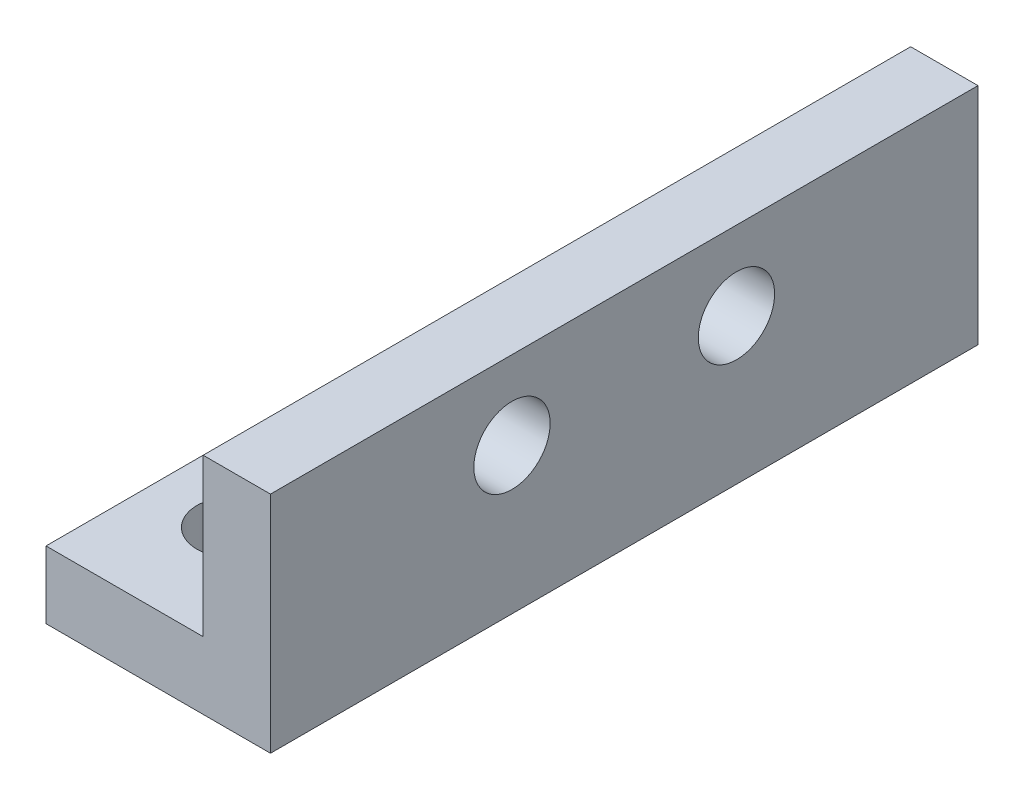
ISO-10303-21;
HEADER;
FILE_DESCRIPTION(('STEP AP214'),'2;1');
FILE_NAME('part.step','',(''),(''),'','','');
FILE_SCHEMA(('AUTOMOTIVE_DESIGN { 1 0 10303 214 1 1 1 1 }'));
ENDSEC;
DATA;
#1=APPLICATION_CONTEXT('core data for automotive mechanical design processes');
#2=APPLICATION_PROTOCOL_DEFINITION('international standard','automotive_design',2000,#1);
#3=PRODUCT_CONTEXT('',#1,'mechanical');
#4=PRODUCT('Part','Part','',(#3));
#5=PRODUCT_RELATED_PRODUCT_CATEGORY('part','',(#4));
#6=PRODUCT_DEFINITION_FORMATION('','',#4);
#7=PRODUCT_DEFINITION_CONTEXT('part definition',#1,'design');
#8=PRODUCT_DEFINITION('design','',#6,#7);
#9=PRODUCT_DEFINITION_SHAPE('','',#8);
#10=(LENGTH_UNIT() NAMED_UNIT(*) SI_UNIT(.MILLI.,.METRE.));
#11=(NAMED_UNIT(*) PLANE_ANGLE_UNIT() SI_UNIT($,.RADIAN.));
#12=(NAMED_UNIT(*) SI_UNIT($,.STERADIAN.) SOLID_ANGLE_UNIT());
#13=UNCERTAINTY_MEASURE_WITH_UNIT(LENGTH_MEASURE(1.E-05),#10,'distance_accuracy_value','');
#14=(GEOMETRIC_REPRESENTATION_CONTEXT(3) GLOBAL_UNCERTAINTY_ASSIGNED_CONTEXT((#13)) GLOBAL_UNIT_ASSIGNED_CONTEXT((#10,
#11,#12)) REPRESENTATION_CONTEXT('',''));
#15=CARTESIAN_POINT('',(0.,0.,0.));
#16=DIRECTION('',(0.,0.,1.));
#17=DIRECTION('',(1.,0.,0.));
#18=AXIS2_PLACEMENT_3D('',#15,#16,#17);
#19=CARTESIAN_POINT('',(-5.,-2.,31.52));
#20=DIRECTION('',(0.,-1.,0.));
#21=DIRECTION('',(0.,0.,-1.));
#22=AXIS2_PLACEMENT_3D('',#19,#20,#21);
#23=PLANE('',#22);
#24=CARTESIAN_POINT('',(-1.5,-2.,26.585));
#25=DIRECTION('',(0.,1.,0.));
#26=DIRECTION('',(0.,0.,1.));
#27=AXIS2_PLACEMENT_3D('',#24,#25,#26);
#28=CIRCLE('',#27,1.7);
#29=CARTESIAN_POINT('',(-1.5,-2.,28.285));
#30=VERTEX_POINT('',#29);
#31=EDGE_CURVE('E160',#30,#30,#28,.T.);
#32=ORIENTED_EDGE('',*,*,#31,.F.);
#33=EDGE_LOOP('',(#32));
#34=FACE_BOUND('',#33,.T.);
#35=DIRECTION('',(-1.,0.,0.));
#36=VECTOR('',#35,1.);
#37=CARTESIAN_POINT('',(-5.,-2.,0.));
#38=LINE('',#37,#36);
#39=CARTESIAN_POINT('',(2.,-2.,0.));
#40=VERTEX_POINT('',#39);
#41=CARTESIAN_POINT('',(-5.,-2.,0.));
#42=VERTEX_POINT('',#41);
#43=EDGE_CURVE('E85',#40,#42,#38,.T.);
#44=ORIENTED_EDGE('',*,*,#43,.T.);
#45=DIRECTION('',(0.,0.,-1.));
#46=VECTOR('',#45,1.);
#47=CARTESIAN_POINT('',(-5.,-2.,31.52));
#48=LINE('',#47,#46);
#49=CARTESIAN_POINT('',(-5.,-2.,31.52));
#50=VERTEX_POINT('',#49);
#51=EDGE_CURVE('E120',#50,#42,#48,.T.);
#52=ORIENTED_EDGE('',*,*,#51,.F.);
#53=DIRECTION('',(-1.,0.,0.));
#54=VECTOR('',#53,1.);
#55=CARTESIAN_POINT('',(-5.,-2.,31.52));
#56=LINE('',#55,#54);
#57=CARTESIAN_POINT('',(2.,-2.,31.52));
#58=VERTEX_POINT('',#57);
#59=EDGE_CURVE('E56',#58,#50,#56,.T.);
#60=ORIENTED_EDGE('',*,*,#59,.F.);
#61=DIRECTION('',(0.,0.,-1.));
#62=VECTOR('',#61,1.);
#63=CARTESIAN_POINT('',(2.,-2.,31.52));
#64=LINE('',#63,#62);
#65=EDGE_CURVE('E116',#58,#40,#64,.T.);
#66=ORIENTED_EDGE('',*,*,#65,.T.);
#67=EDGE_LOOP('',(#44,#52,#60,#66));
#68=FACE_BOUND('',#67,.T.);
#69=CARTESIAN_POINT('',(-1.5,-2.,4.935));
#70=DIRECTION('',(0.,1.,0.));
#71=DIRECTION('',(0.,0.,1.));
#72=AXIS2_PLACEMENT_3D('',#69,#70,#71);
#73=CIRCLE('',#72,1.7);
#74=CARTESIAN_POINT('',(-1.5,-2.,6.635));
#75=VERTEX_POINT('',#74);
#76=EDGE_CURVE('E154',#75,#75,#73,.T.);
#77=ORIENTED_EDGE('',*,*,#76,.F.);
#78=EDGE_LOOP('',(#77));
#79=FACE_BOUND('',#78,.T.);
#80=ADVANCED_FACE('F39',(#34,#68,#79),#23,.F.);
#81=CARTESIAN_POINT('',(-5.,-5.,31.52));
#82=DIRECTION('',(1.,0.,0.));
#83=DIRECTION('',(0.,0.,-1.));
#84=AXIS2_PLACEMENT_3D('',#81,#82,#83);
#85=PLANE('',#84);
#86=DIRECTION('',(0.,-1.,0.));
#87=VECTOR('',#86,1.);
#88=CARTESIAN_POINT('',(-5.,-5.,0.));
#89=LINE('',#88,#87);
#90=CARTESIAN_POINT('',(-5.,-5.,0.));
#91=VERTEX_POINT('',#90);
#92=EDGE_CURVE('E124',#42,#91,#89,.T.);
#93=ORIENTED_EDGE('',*,*,#92,.T.);
#94=DIRECTION('',(0.,0.,-1.));
#95=VECTOR('',#94,1.);
#96=CARTESIAN_POINT('',(-5.,-5.,31.52));
#97=LINE('',#96,#95);
#98=CARTESIAN_POINT('',(-5.,-5.,31.52));
#99=VERTEX_POINT('',#98);
#100=EDGE_CURVE('E11',#99,#91,#97,.T.);
#101=ORIENTED_EDGE('',*,*,#100,.F.);
#102=DIRECTION('',(0.,-1.,0.));
#103=VECTOR('',#102,1.);
#104=CARTESIAN_POINT('',(-5.,-5.,31.52));
#105=LINE('',#104,#103);
#106=EDGE_CURVE('E135',#50,#99,#105,.T.);
#107=ORIENTED_EDGE('',*,*,#106,.F.);
#108=ORIENTED_EDGE('',*,*,#51,.T.);
#109=EDGE_LOOP('',(#93,#101,#107,#108));
#110=FACE_BOUND('',#109,.T.);
#111=ADVANCED_FACE('F41',(#110),#85,.F.);
#112=CARTESIAN_POINT('',(5.,-5.,31.52));
#113=DIRECTION('',(0.,1.,0.));
#114=DIRECTION('',(-1.,0.,0.));
#115=AXIS2_PLACEMENT_3D('',#112,#113,#114);
#116=PLANE('',#115);
#117=CARTESIAN_POINT('',(-1.5,-5.,4.935));
#118=DIRECTION('',(0.,1.,0.));
#119=DIRECTION('',(0.,0.,1.));
#120=AXIS2_PLACEMENT_3D('',#117,#118,#119);
#121=CIRCLE('',#120,1.7);
#122=CARTESIAN_POINT('',(-1.5,-5.,6.635));
#123=VERTEX_POINT('',#122);
#124=EDGE_CURVE('E156',#123,#123,#121,.T.);
#125=ORIENTED_EDGE('',*,*,#124,.T.);
#126=EDGE_LOOP('',(#125));
#127=FACE_BOUND('',#126,.T.);
#128=CARTESIAN_POINT('',(-1.5,-5.,26.585));
#129=DIRECTION('',(0.,1.,0.));
#130=DIRECTION('',(0.,0.,1.));
#131=AXIS2_PLACEMENT_3D('',#128,#129,#130);
#132=CIRCLE('',#131,1.7);
#133=CARTESIAN_POINT('',(-1.5,-5.,28.285));
#134=VERTEX_POINT('',#133);
#135=EDGE_CURVE('E128',#134,#134,#132,.T.);
#136=ORIENTED_EDGE('',*,*,#135,.T.);
#137=EDGE_LOOP('',(#136));
#138=FACE_BOUND('',#137,.T.);
#139=DIRECTION('',(1.,0.,0.));
#140=VECTOR('',#139,1.);
#141=CARTESIAN_POINT('',(5.,-5.,0.));
#142=LINE('',#141,#140);
#143=CARTESIAN_POINT('',(5.,-5.,0.));
#144=VERTEX_POINT('',#143);
#145=EDGE_CURVE('E127',#91,#144,#142,.T.);
#146=ORIENTED_EDGE('',*,*,#145,.T.);
#147=DIRECTION('',(0.,0.,-1.));
#148=VECTOR('',#147,1.);
#149=CARTESIAN_POINT('',(5.,-5.,31.52));
#150=LINE('',#149,#148);
#151=CARTESIAN_POINT('',(5.,-5.,31.52));
#152=VERTEX_POINT('',#151);
#153=EDGE_CURVE('E48',#152,#144,#150,.T.);
#154=ORIENTED_EDGE('',*,*,#153,.F.);
#155=DIRECTION('',(1.,0.,0.));
#156=VECTOR('',#155,1.);
#157=CARTESIAN_POINT('',(5.,-5.,31.52));
#158=LINE('',#157,#156);
#159=EDGE_CURVE('E93',#99,#152,#158,.T.);
#160=ORIENTED_EDGE('',*,*,#159,.F.);
#161=ORIENTED_EDGE('',*,*,#100,.T.);
#162=EDGE_LOOP('',(#146,#154,#160,#161));
#163=FACE_BOUND('',#162,.T.);
#164=ADVANCED_FACE('F174',(#127,#138,#163),#116,.F.);
#165=CARTESIAN_POINT('',(5.,5.,31.52));
#166=DIRECTION('',(-1.,0.,0.));
#167=DIRECTION('',(0.,0.,1.));
#168=AXIS2_PLACEMENT_3D('',#165,#166,#167);
#169=PLANE('',#168);
#170=CARTESIAN_POINT('',(5.,1.5,10.76));
#171=DIRECTION('',(-1.,0.,0.));
#172=DIRECTION('',(0.,0.,1.));
#173=AXIS2_PLACEMENT_3D('',#170,#171,#172);
#174=CIRCLE('',#173,1.69999999999999);
#175=CARTESIAN_POINT('',(5.,1.5,12.46));
#176=VERTEX_POINT('',#175);
#177=EDGE_CURVE('E284',#176,#176,#174,.T.);
#178=ORIENTED_EDGE('',*,*,#177,.T.);
#179=EDGE_LOOP('',(#178));
#180=FACE_BOUND('',#179,.T.);
#181=CARTESIAN_POINT('',(5.,1.5,20.76));
#182=DIRECTION('',(-1.,0.,0.));
#183=DIRECTION('',(0.,0.,1.));
#184=AXIS2_PLACEMENT_3D('',#181,#182,#183);
#185=CIRCLE('',#184,1.69999999999999);
#186=CARTESIAN_POINT('',(5.,1.5,22.46));
#187=VERTEX_POINT('',#186);
#188=EDGE_CURVE('E157',#187,#187,#185,.T.);
#189=ORIENTED_EDGE('',*,*,#188,.T.);
#190=EDGE_LOOP('',(#189));
#191=FACE_BOUND('',#190,.T.);
#192=DIRECTION('',(0.,1.,0.));
#193=VECTOR('',#192,1.);
#194=CARTESIAN_POINT('',(5.,5.,0.));
#195=LINE('',#194,#193);
#196=CARTESIAN_POINT('',(5.,5.,0.));
#197=VERTEX_POINT('',#196);
#198=EDGE_CURVE('E130',#144,#197,#195,.T.);
#199=ORIENTED_EDGE('',*,*,#198,.T.);
#200=DIRECTION('',(0.,0.,-1.));
#201=VECTOR('',#200,1.);
#202=CARTESIAN_POINT('',(5.,5.,31.52));
#203=LINE('',#202,#201);
#204=CARTESIAN_POINT('',(5.,5.,31.52));
#205=VERTEX_POINT('',#204);
#206=EDGE_CURVE('E115',#205,#197,#203,.T.);
#207=ORIENTED_EDGE('',*,*,#206,.F.);
#208=DIRECTION('',(0.,1.,0.));
#209=VECTOR('',#208,1.);
#210=CARTESIAN_POINT('',(5.,5.,31.52));
#211=LINE('',#210,#209);
#212=EDGE_CURVE('E106',#152,#205,#211,.T.);
#213=ORIENTED_EDGE('',*,*,#212,.F.);
#214=ORIENTED_EDGE('',*,*,#153,.T.);
#215=EDGE_LOOP('',(#199,#207,#213,#214));
#216=FACE_BOUND('',#215,.T.);
#217=ADVANCED_FACE('F141',(#180,#191,#216),#169,.F.);
#218=CARTESIAN_POINT('',(2.,5.,31.52));
#219=DIRECTION('',(0.,-1.,0.));
#220=DIRECTION('',(0.,0.,-1.));
#221=AXIS2_PLACEMENT_3D('',#218,#219,#220);
#222=PLANE('',#221);
#223=DIRECTION('',(-1.,0.,0.));
#224=VECTOR('',#223,1.);
#225=CARTESIAN_POINT('',(2.,5.,0.));
#226=LINE('',#225,#224);
#227=CARTESIAN_POINT('',(2.,5.,0.));
#228=VERTEX_POINT('',#227);
#229=EDGE_CURVE('E114',#197,#228,#226,.T.);
#230=ORIENTED_EDGE('',*,*,#229,.T.);
#231=DIRECTION('',(0.,0.,-1.));
#232=VECTOR('',#231,1.);
#233=CARTESIAN_POINT('',(2.,5.,31.52));
#234=LINE('',#233,#232);
#235=CARTESIAN_POINT('',(2.,5.,31.52));
#236=VERTEX_POINT('',#235);
#237=EDGE_CURVE('E111',#236,#228,#234,.T.);
#238=ORIENTED_EDGE('',*,*,#237,.F.);
#239=DIRECTION('',(-1.,0.,0.));
#240=VECTOR('',#239,1.);
#241=CARTESIAN_POINT('',(2.,5.,31.52));
#242=LINE('',#241,#240);
#243=EDGE_CURVE('E100',#205,#236,#242,.T.);
#244=ORIENTED_EDGE('',*,*,#243,.F.);
#245=ORIENTED_EDGE('',*,*,#206,.T.);
#246=EDGE_LOOP('',(#230,#238,#244,#245));
#247=FACE_BOUND('',#246,.T.);
#248=ADVANCED_FACE('F112',(#247),#222,.F.);
#249=CARTESIAN_POINT('',(2.,-2.,31.52));
#250=DIRECTION('',(1.,0.,0.));
#251=DIRECTION('',(0.,0.,-1.));
#252=AXIS2_PLACEMENT_3D('',#249,#250,#251);
#253=PLANE('',#252);
#254=CARTESIAN_POINT('',(2.,1.5,10.76));
#255=DIRECTION('',(-1.,0.,0.));
#256=DIRECTION('',(0.,0.,1.));
#257=AXIS2_PLACEMENT_3D('',#254,#255,#256);
#258=CIRCLE('',#257,1.69999999999999);
#259=CARTESIAN_POINT('',(2.,1.5,12.46));
#260=VERTEX_POINT('',#259);
#261=EDGE_CURVE('E287',#260,#260,#258,.T.);
#262=ORIENTED_EDGE('',*,*,#261,.F.);
#263=EDGE_LOOP('',(#262));
#264=FACE_BOUND('',#263,.T.);
#265=CARTESIAN_POINT('',(2.,1.5,20.76));
#266=DIRECTION('',(-1.,0.,0.));
#267=DIRECTION('',(0.,0.,1.));
#268=AXIS2_PLACEMENT_3D('',#265,#266,#267);
#269=CIRCLE('',#268,1.69999999999999);
#270=CARTESIAN_POINT('',(2.,1.5,22.46));
#271=VERTEX_POINT('',#270);
#272=EDGE_CURVE('E163',#271,#271,#269,.T.);
#273=ORIENTED_EDGE('',*,*,#272,.F.);
#274=EDGE_LOOP('',(#273));
#275=FACE_BOUND('',#274,.T.);
#276=DIRECTION('',(0.,-1.,0.));
#277=VECTOR('',#276,1.);
#278=CARTESIAN_POINT('',(2.,-2.,0.));
#279=LINE('',#278,#277);
#280=EDGE_CURVE('E79',#228,#40,#279,.T.);
#281=ORIENTED_EDGE('',*,*,#280,.T.);
#282=ORIENTED_EDGE('',*,*,#65,.F.);
#283=DIRECTION('',(0.,-1.,0.));
#284=VECTOR('',#283,1.);
#285=CARTESIAN_POINT('',(2.,-2.,31.52));
#286=LINE('',#285,#284);
#287=EDGE_CURVE('E104',#236,#58,#286,.T.);
#288=ORIENTED_EDGE('',*,*,#287,.F.);
#289=ORIENTED_EDGE('',*,*,#237,.T.);
#290=EDGE_LOOP('',(#281,#282,#288,#289));
#291=FACE_BOUND('',#290,.T.);
#292=ADVANCED_FACE('F118',(#264,#275,#291),#253,.F.);
#293=CARTESIAN_POINT('',(0.,0.,31.52));
#294=DIRECTION('',(0.,0.,-1.));
#295=DIRECTION('',(-1.,0.,0.));
#296=AXIS2_PLACEMENT_3D('',#293,#294,#295);
#297=PLANE('',#296);
#298=ORIENTED_EDGE('',*,*,#106,.T.);
#299=ORIENTED_EDGE('',*,*,#159,.T.);
#300=ORIENTED_EDGE('',*,*,#212,.T.);
#301=ORIENTED_EDGE('',*,*,#243,.T.);
#302=ORIENTED_EDGE('',*,*,#287,.T.);
#303=ORIENTED_EDGE('',*,*,#59,.T.);
#304=EDGE_LOOP('',(#298,#299,#300,#301,#302,#303));
#305=FACE_BOUND('',#304,.T.);
#306=ADVANCED_FACE('F102',(#305),#297,.F.);
#307=CARTESIAN_POINT('',(0.,0.,0.));
#308=DIRECTION('',(0.,0.,-1.));
#309=DIRECTION('',(-1.,0.,0.));
#310=AXIS2_PLACEMENT_3D('',#307,#308,#309);
#311=PLANE('',#310);
#312=ORIENTED_EDGE('',*,*,#92,.F.);
#313=ORIENTED_EDGE('',*,*,#43,.F.);
#314=ORIENTED_EDGE('',*,*,#280,.F.);
#315=ORIENTED_EDGE('',*,*,#229,.F.);
#316=ORIENTED_EDGE('',*,*,#198,.F.);
#317=ORIENTED_EDGE('',*,*,#145,.F.);
#318=EDGE_LOOP('',(#312,#313,#314,#315,#316,#317));
#319=FACE_BOUND('',#318,.T.);
#320=ADVANCED_FACE('F144',(#319),#311,.T.);
#321=CARTESIAN_POINT('',(-1.5,-2.,26.585));
#322=DIRECTION('',(0.,1.,0.));
#323=DIRECTION('',(0.,0.,1.));
#324=AXIS2_PLACEMENT_3D('',#321,#322,#323);
#325=CYLINDRICAL_SURFACE('',#324,1.7);
#326=ORIENTED_EDGE('',*,*,#135,.F.);
#327=EDGE_LOOP('',(#326));
#328=FACE_BOUND('',#327,.T.);
#329=ORIENTED_EDGE('',*,*,#31,.T.);
#330=EDGE_LOOP('',(#329));
#331=FACE_BOUND('',#330,.T.);
#332=ADVANCED_FACE('F176',(#328,#331),#325,.F.);
#333=CARTESIAN_POINT('',(-1.5,-2.,4.935));
#334=DIRECTION('',(0.,1.,0.));
#335=DIRECTION('',(0.,0.,1.));
#336=AXIS2_PLACEMENT_3D('',#333,#334,#335);
#337=CYLINDRICAL_SURFACE('',#336,1.7);
#338=ORIENTED_EDGE('',*,*,#124,.F.);
#339=EDGE_LOOP('',(#338));
#340=FACE_BOUND('',#339,.T.);
#341=ORIENTED_EDGE('',*,*,#76,.T.);
#342=EDGE_LOOP('',(#341));
#343=FACE_BOUND('',#342,.T.);
#344=ADVANCED_FACE('F179',(#340,#343),#337,.F.);
#345=CARTESIAN_POINT('',(2.,1.5,20.76));
#346=DIRECTION('',(-1.,0.,0.));
#347=DIRECTION('',(0.,0.,1.));
#348=AXIS2_PLACEMENT_3D('',#345,#346,#347);
#349=CYLINDRICAL_SURFACE('',#348,1.69999999999999);
#350=ORIENTED_EDGE('',*,*,#188,.F.);
#351=EDGE_LOOP('',(#350));
#352=FACE_BOUND('',#351,.T.);
#353=ORIENTED_EDGE('',*,*,#272,.T.);
#354=EDGE_LOOP('',(#353));
#355=FACE_BOUND('',#354,.T.);
#356=ADVANCED_FACE('F186',(#352,#355),#349,.F.);
#357=CARTESIAN_POINT('',(2.,1.5,10.76));
#358=DIRECTION('',(-1.,0.,0.));
#359=DIRECTION('',(0.,0.,1.));
#360=AXIS2_PLACEMENT_3D('',#357,#358,#359);
#361=CYLINDRICAL_SURFACE('',#360,1.69999999999999);
#362=ORIENTED_EDGE('',*,*,#177,.F.);
#363=EDGE_LOOP('',(#362));
#364=FACE_BOUND('',#363,.T.);
#365=ORIENTED_EDGE('',*,*,#261,.T.);
#366=EDGE_LOOP('',(#365));
#367=FACE_BOUND('',#366,.T.);
#368=ADVANCED_FACE('F250',(#364,#367),#361,.F.);
#369=CLOSED_SHELL('',(#80,#111,#164,#217,#248,#292,#306,#320,#332,#344,#356,#368));
#370=MANIFOLD_SOLID_BREP('B2',#369);
#371=ADVANCED_BREP_SHAPE_REPRESENTATION('',(#18,#370),#14);
#372=SHAPE_DEFINITION_REPRESENTATION(#9,#371);
ENDSEC;
END-ISO-10303-21;
